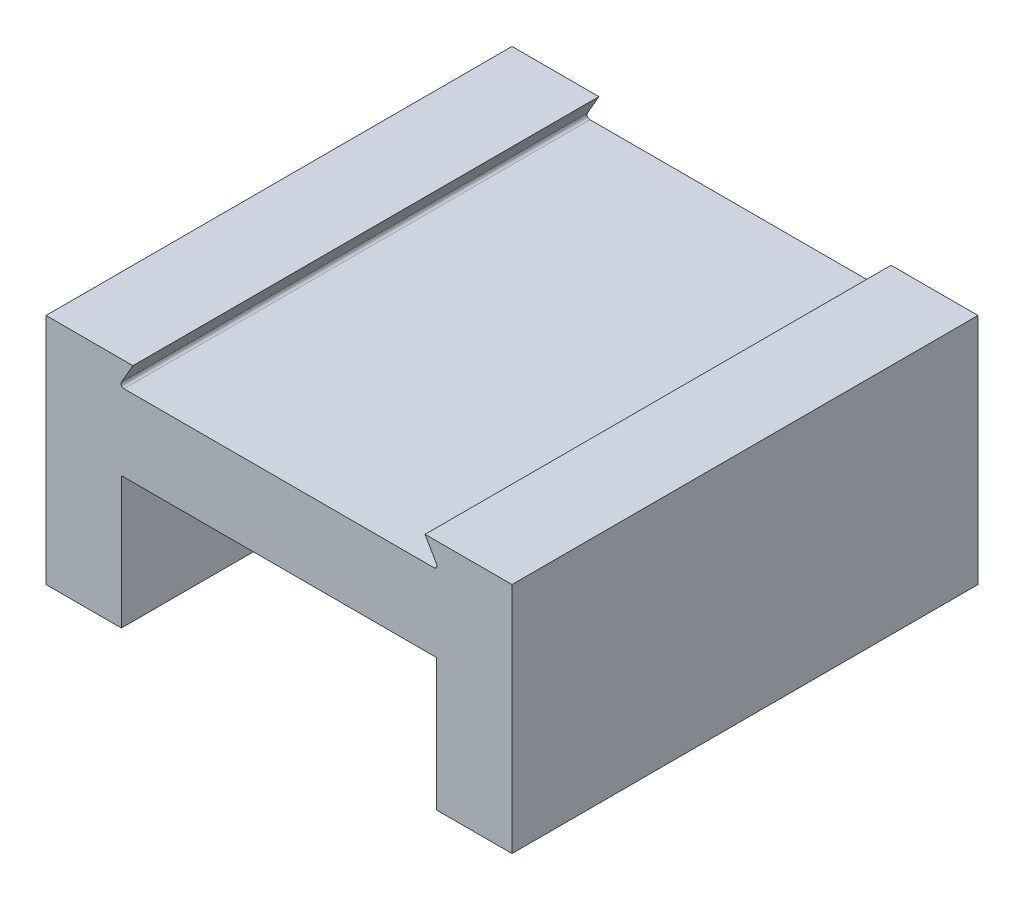
ISO-10303-21;
HEADER;
FILE_DESCRIPTION(('STEP AP214'),'2;1');
FILE_NAME('part.step','',(''),(''),'','','');
FILE_SCHEMA(('AUTOMOTIVE_DESIGN { 1 0 10303 214 1 1 1 1 }'));
ENDSEC;
DATA;
#1=APPLICATION_CONTEXT('core data for automotive mechanical design processes');
#2=APPLICATION_PROTOCOL_DEFINITION('international standard','automotive_design',2000,#1);
#3=PRODUCT_CONTEXT('',#1,'mechanical');
#4=PRODUCT('Part','Part','',(#3));
#5=PRODUCT_RELATED_PRODUCT_CATEGORY('part','',(#4));
#6=PRODUCT_DEFINITION_FORMATION('','',#4);
#7=PRODUCT_DEFINITION_CONTEXT('part definition',#1,'design');
#8=PRODUCT_DEFINITION('design','',#6,#7);
#9=PRODUCT_DEFINITION_SHAPE('','',#8);
#10=(LENGTH_UNIT() NAMED_UNIT(*) SI_UNIT(.MILLI.,.METRE.));
#11=(NAMED_UNIT(*) PLANE_ANGLE_UNIT() SI_UNIT($,.RADIAN.));
#12=(NAMED_UNIT(*) SI_UNIT($,.STERADIAN.) SOLID_ANGLE_UNIT());
#13=UNCERTAINTY_MEASURE_WITH_UNIT(LENGTH_MEASURE(1.E-05),#10,'distance_accuracy_value','');
#14=(GEOMETRIC_REPRESENTATION_CONTEXT(3) GLOBAL_UNCERTAINTY_ASSIGNED_CONTEXT((#13)) GLOBAL_UNIT_ASSIGNED_CONTEXT((#10,
#11,#12)) REPRESENTATION_CONTEXT('',''));
#15=CARTESIAN_POINT('',(0.,0.,0.));
#16=DIRECTION('',(0.,0.,1.));
#17=DIRECTION('',(1.,0.,0.));
#18=AXIS2_PLACEMENT_3D('',#15,#16,#17);
#19=CARTESIAN_POINT('',(-23.3046850178701,17.7004444554026,60.));
#20=DIRECTION('',(0.,-1.,0.));
#21=DIRECTION('',(1.,0.,0.));
#22=AXIS2_PLACEMENT_3D('',#19,#20,#21);
#23=PLANE('',#22);
#24=DIRECTION('',(-1.,0.,0.));
#25=VECTOR('',#24,1.);
#26=CARTESIAN_POINT('',(-23.3046850178701,17.7004444554026,0.));
#27=LINE('',#26,#25);
#28=CARTESIAN_POINT('',(-12.1110316699223,17.7004444554023,0.));
#29=VERTEX_POINT('',#28);
#30=CARTESIAN_POINT('',(-23.3046850178701,17.7004444554026,0.));
#31=VERTEX_POINT('',#30);
#32=EDGE_CURVE('E167',#29,#31,#27,.T.);
#33=ORIENTED_EDGE('',*,*,#32,.T.);
#34=DIRECTION('',(0.,0.,-1.));
#35=VECTOR('',#34,1.);
#36=CARTESIAN_POINT('',(-23.3046850178701,17.7004444554026,60.));
#37=LINE('',#36,#35);
#38=CARTESIAN_POINT('',(-23.3046850178701,17.7004444554026,60.));
#39=VERTEX_POINT('',#38);
#40=EDGE_CURVE('E11',#39,#31,#37,.T.);
#41=ORIENTED_EDGE('',*,*,#40,.F.);
#42=DIRECTION('',(-1.,0.,0.));
#43=VECTOR('',#42,1.);
#44=CARTESIAN_POINT('',(-23.3046850178701,17.7004444554026,60.));
#45=LINE('',#44,#43);
#46=CARTESIAN_POINT('',(-12.1110316699223,17.7004444554023,60.));
#47=VERTEX_POINT('',#46);
#48=EDGE_CURVE('E194',#47,#39,#45,.T.);
#49=ORIENTED_EDGE('',*,*,#48,.F.);
#50=DIRECTION('',(0.,0.,-1.));
#51=VECTOR('',#50,1.);
#52=CARTESIAN_POINT('',(-12.1110316699223,17.7004444554023,60.));
#53=LINE('',#52,#51);
#54=EDGE_CURVE('E163',#47,#29,#53,.T.);
#55=ORIENTED_EDGE('',*,*,#54,.T.);
#56=EDGE_LOOP('',(#33,#41,#49,#55));
#57=FACE_BOUND('',#56,.T.);
#58=ADVANCED_FACE('F35',(#57),#23,.F.);
#59=CARTESIAN_POINT('',(-23.3046850178701,17.7004444554026,60.));
#60=DIRECTION('',(1.,0.,0.));
#61=DIRECTION('',(0.,1.,0.));
#62=AXIS2_PLACEMENT_3D('',#59,#60,#61);
#63=PLANE('',#62);
#64=CARTESIAN_POINT('',(-23.3046850178701,-2.2995555445976,15.));
#65=DIRECTION('',(-1.,0.,0.));
#66=DIRECTION('',(0.,-1.,0.));
#67=AXIS2_PLACEMENT_3D('',#64,#65,#66);
#68=CIRCLE('',#67,4.25000000000001);
#69=CARTESIAN_POINT('',(-23.3046850178701,-6.5495555445976,15.));
#70=VERTEX_POINT('',#69);
#71=EDGE_CURVE('E373',#70,#70,#68,.T.);
#72=ORIENTED_EDGE('',*,*,#71,.F.);
#73=EDGE_LOOP('',(#72));
#74=FACE_BOUND('',#73,.T.);
#75=CARTESIAN_POINT('',(-23.3046850178701,-2.2995555445976,45.));
#76=DIRECTION('',(-1.,0.,0.));
#77=DIRECTION('',(0.,1.,0.));
#78=AXIS2_PLACEMENT_3D('',#75,#76,#77);
#79=CIRCLE('',#78,4.25);
#80=CARTESIAN_POINT('',(-23.3046850178701,1.9504444554024,45.));
#81=VERTEX_POINT('',#80);
#82=EDGE_CURVE('E378',#81,#81,#79,.T.);
#83=ORIENTED_EDGE('',*,*,#82,.F.);
#84=EDGE_LOOP('',(#83));
#85=FACE_BOUND('',#84,.T.);
#86=DIRECTION('',(0.,-1.,0.));
#87=VECTOR('',#86,1.);
#88=CARTESIAN_POINT('',(-23.3046850178701,17.7004444554026,0.));
#89=LINE('',#88,#87);
#90=CARTESIAN_POINT('',(-23.3046850178701,-12.2995555445976,0.));
#91=VERTEX_POINT('',#90);
#92=EDGE_CURVE('E170',#31,#91,#89,.T.);
#93=ORIENTED_EDGE('',*,*,#92,.T.);
#94=DIRECTION('',(0.,0.,-1.));
#95=VECTOR('',#94,1.);
#96=CARTESIAN_POINT('',(-23.3046850178701,-12.2995555445976,60.));
#97=LINE('',#96,#95);
#98=CARTESIAN_POINT('',(-23.3046850178701,-12.2995555445976,60.));
#99=VERTEX_POINT('',#98);
#100=EDGE_CURVE('E43',#99,#91,#97,.T.);
#101=ORIENTED_EDGE('',*,*,#100,.F.);
#102=DIRECTION('',(0.,-1.,0.));
#103=VECTOR('',#102,1.);
#104=CARTESIAN_POINT('',(-23.3046850178701,17.7004444554026,60.));
#105=LINE('',#104,#103);
#106=EDGE_CURVE('E112',#39,#99,#105,.T.);
#107=ORIENTED_EDGE('',*,*,#106,.F.);
#108=ORIENTED_EDGE('',*,*,#40,.T.);
#109=EDGE_LOOP('',(#93,#101,#107,#108));
#110=FACE_BOUND('',#109,.T.);
#111=ADVANCED_FACE('F282',(#74,#85,#110),#63,.F.);
#112=CARTESIAN_POINT('',(-23.3046850178701,-12.2995555445976,60.));
#113=DIRECTION('',(0.,1.,0.));
#114=DIRECTION('',(0.,0.,1.));
#115=AXIS2_PLACEMENT_3D('',#112,#113,#114);
#116=PLANE('',#115);
#117=DIRECTION('',(1.,0.,0.));
#118=VECTOR('',#117,1.);
#119=CARTESIAN_POINT('',(-23.3046850178701,-12.2995555445976,0.));
#120=LINE('',#119,#118);
#121=CARTESIAN_POINT('',(-13.5997293390279,-12.2995555445976,0.));
#122=VERTEX_POINT('',#121);
#123=EDGE_CURVE('E173',#91,#122,#120,.T.);
#124=ORIENTED_EDGE('',*,*,#123,.T.);
#125=DIRECTION('',(0.,0.,-1.));
#126=VECTOR('',#125,1.);
#127=CARTESIAN_POINT('',(-13.5997293390279,-12.2995555445976,60.));
#128=LINE('',#127,#126);
#129=CARTESIAN_POINT('',(-13.5997293390279,-12.2995555445976,60.));
#130=VERTEX_POINT('',#129);
#131=EDGE_CURVE('E219',#130,#122,#128,.T.);
#132=ORIENTED_EDGE('',*,*,#131,.F.);
#133=DIRECTION('',(1.,0.,0.));
#134=VECTOR('',#133,1.);
#135=CARTESIAN_POINT('',(-23.3046850178701,-12.2995555445976,60.));
#136=LINE('',#135,#134);
#137=EDGE_CURVE('E227',#99,#130,#136,.T.);
#138=ORIENTED_EDGE('',*,*,#137,.F.);
#139=ORIENTED_EDGE('',*,*,#100,.T.);
#140=EDGE_LOOP('',(#124,#132,#138,#139));
#141=FACE_BOUND('',#140,.T.);
#142=ADVANCED_FACE('F225',(#141),#116,.F.);
#143=CARTESIAN_POINT('',(-13.5997293390279,-12.2995555445976,60.));
#144=DIRECTION('',(-1.,0.,0.));
#145=DIRECTION('',(0.,-1.,0.));
#146=AXIS2_PLACEMENT_3D('',#143,#144,#145);
#147=PLANE('',#146);
#148=CARTESIAN_POINT('',(-13.5997293390279,-2.2995555445976,15.));
#149=DIRECTION('',(-1.,0.,0.));
#150=DIRECTION('',(0.,-1.,0.));
#151=AXIS2_PLACEMENT_3D('',#148,#149,#150);
#152=CIRCLE('',#151,4.25000000000001);
#153=CARTESIAN_POINT('',(-13.5997293390279,-6.5495555445976,15.));
#154=VERTEX_POINT('',#153);
#155=EDGE_CURVE('E171',#154,#154,#152,.F.);
#156=ORIENTED_EDGE('',*,*,#155,.F.);
#157=EDGE_LOOP('',(#156));
#158=FACE_BOUND('',#157,.T.);
#159=CARTESIAN_POINT('',(-13.5997293390279,-2.2995555445976,45.));
#160=DIRECTION('',(-1.,0.,0.));
#161=DIRECTION('',(0.,-1.,0.));
#162=AXIS2_PLACEMENT_3D('',#159,#160,#161);
#163=CIRCLE('',#162,4.25);
#164=CARTESIAN_POINT('',(-13.5997293390279,-6.54955554459759,45.));
#165=VERTEX_POINT('',#164);
#166=EDGE_CURVE('E374',#165,#165,#163,.F.);
#167=ORIENTED_EDGE('',*,*,#166,.F.);
#168=EDGE_LOOP('',(#167));
#169=FACE_BOUND('',#168,.T.);
#170=DIRECTION('',(0.,1.,0.));
#171=VECTOR('',#170,1.);
#172=CARTESIAN_POINT('',(-13.5997293390279,-12.2995555445976,0.));
#173=LINE('',#172,#171);
#174=CARTESIAN_POINT('',(-13.5997293390278,4.70044445540232,0.));
#175=VERTEX_POINT('',#174);
#176=EDGE_CURVE('E175',#122,#175,#173,.T.);
#177=ORIENTED_EDGE('',*,*,#176,.T.);
#178=DIRECTION('',(0.,0.,-1.));
#179=VECTOR('',#178,1.);
#180=CARTESIAN_POINT('',(-13.5997293390278,4.70044445540232,60.));
#181=LINE('',#180,#179);
#182=CARTESIAN_POINT('',(-13.5997293390278,4.70044445540232,60.));
#183=VERTEX_POINT('',#182);
#184=EDGE_CURVE('E216',#183,#175,#181,.T.);
#185=ORIENTED_EDGE('',*,*,#184,.F.);
#186=DIRECTION('',(0.,1.,0.));
#187=VECTOR('',#186,1.);
#188=CARTESIAN_POINT('',(-13.5997293390279,-12.2995555445976,60.));
#189=LINE('',#188,#187);
#190=EDGE_CURVE('E245',#130,#183,#189,.T.);
#191=ORIENTED_EDGE('',*,*,#190,.F.);
#192=ORIENTED_EDGE('',*,*,#131,.T.);
#193=EDGE_LOOP('',(#177,#185,#191,#192));
#194=FACE_BOUND('',#193,.T.);
#195=ADVANCED_FACE('F236',(#158,#169,#194),#147,.F.);
#196=CARTESIAN_POINT('',(-13.5997293390278,4.70044445540232,60.));
#197=DIRECTION('',(0.,1.,0.));
#198=DIRECTION('',(0.,0.,1.));
#199=AXIS2_PLACEMENT_3D('',#196,#197,#198);
#200=PLANE('',#199);
#201=DIRECTION('',(1.,0.,0.));
#202=VECTOR('',#201,1.);
#203=CARTESIAN_POINT('',(-13.5997293390278,4.70044445540232,0.));
#204=LINE('',#203,#202);
#205=CARTESIAN_POINT('',(26.9903593032884,4.70044445540232,0.));
#206=VERTEX_POINT('',#205);
#207=EDGE_CURVE('E177',#175,#206,#204,.T.);
#208=ORIENTED_EDGE('',*,*,#207,.T.);
#209=DIRECTION('',(0.,0.,-1.));
#210=VECTOR('',#209,1.);
#211=CARTESIAN_POINT('',(26.9903593032884,4.70044445540232,60.));
#212=LINE('',#211,#210);
#213=CARTESIAN_POINT('',(26.9903593032884,4.70044445540232,60.));
#214=VERTEX_POINT('',#213);
#215=EDGE_CURVE('E213',#214,#206,#212,.T.);
#216=ORIENTED_EDGE('',*,*,#215,.F.);
#217=DIRECTION('',(1.,0.,0.));
#218=VECTOR('',#217,1.);
#219=CARTESIAN_POINT('',(-13.5997293390278,4.70044445540232,60.));
#220=LINE('',#219,#218);
#221=EDGE_CURVE('E242',#183,#214,#220,.T.);
#222=ORIENTED_EDGE('',*,*,#221,.F.);
#223=ORIENTED_EDGE('',*,*,#184,.T.);
#224=EDGE_LOOP('',(#208,#216,#222,#223));
#225=FACE_BOUND('',#224,.T.);
#226=ADVANCED_FACE('F240',(#225),#200,.F.);
#227=CARTESIAN_POINT('',(26.9903593032883,-12.2995555445976,60.));
#228=DIRECTION('',(1.,0.,0.));
#229=DIRECTION('',(0.,1.,0.));
#230=AXIS2_PLACEMENT_3D('',#227,#228,#229);
#231=PLANE('',#230);
#232=DIRECTION('',(0.,-1.,0.));
#233=VECTOR('',#232,1.);
#234=CARTESIAN_POINT('',(26.9903593032883,-12.2995555445976,0.));
#235=LINE('',#234,#233);
#236=CARTESIAN_POINT('',(26.9903593032883,-12.2995555445976,0.));
#237=VERTEX_POINT('',#236);
#238=EDGE_CURVE('E179',#206,#237,#235,.T.);
#239=ORIENTED_EDGE('',*,*,#238,.T.);
#240=DIRECTION('',(0.,0.,-1.));
#241=VECTOR('',#240,1.);
#242=CARTESIAN_POINT('',(26.9903593032883,-12.2995555445976,60.));
#243=LINE('',#242,#241);
#244=CARTESIAN_POINT('',(26.9903593032883,-12.2995555445976,60.));
#245=VERTEX_POINT('',#244);
#246=EDGE_CURVE('E210',#245,#237,#243,.T.);
#247=ORIENTED_EDGE('',*,*,#246,.F.);
#248=DIRECTION('',(0.,-1.,0.));
#249=VECTOR('',#248,1.);
#250=CARTESIAN_POINT('',(26.9903593032883,-12.2995555445976,60.));
#251=LINE('',#250,#249);
#252=EDGE_CURVE('E244',#214,#245,#251,.T.);
#253=ORIENTED_EDGE('',*,*,#252,.F.);
#254=ORIENTED_EDGE('',*,*,#215,.T.);
#255=EDGE_LOOP('',(#239,#247,#253,#254));
#256=FACE_BOUND('',#255,.T.);
#257=ADVANCED_FACE('F300',(#256),#231,.F.);
#258=CARTESIAN_POINT('',(26.9903593032883,-12.2995555445976,60.));
#259=DIRECTION('',(0.,1.,0.));
#260=DIRECTION('',(0.,0.,1.));
#261=AXIS2_PLACEMENT_3D('',#258,#259,#260);
#262=PLANE('',#261);
#263=DIRECTION('',(1.,0.,0.));
#264=VECTOR('',#263,1.);
#265=CARTESIAN_POINT('',(26.9903593032883,-12.2995555445976,0.));
#266=LINE('',#265,#264);
#267=CARTESIAN_POINT('',(36.6953149821299,-12.2995555445976,0.));
#268=VERTEX_POINT('',#267);
#269=EDGE_CURVE('E181',#237,#268,#266,.T.);
#270=ORIENTED_EDGE('',*,*,#269,.T.);
#271=DIRECTION('',(0.,0.,-1.));
#272=VECTOR('',#271,1.);
#273=CARTESIAN_POINT('',(36.6953149821299,-12.2995555445976,60.));
#274=LINE('',#273,#272);
#275=CARTESIAN_POINT('',(36.6953149821299,-12.2995555445976,60.));
#276=VERTEX_POINT('',#275);
#277=EDGE_CURVE('E207',#276,#268,#274,.T.);
#278=ORIENTED_EDGE('',*,*,#277,.F.);
#279=DIRECTION('',(1.,0.,0.));
#280=VECTOR('',#279,1.);
#281=CARTESIAN_POINT('',(26.9903593032883,-12.2995555445976,60.));
#282=LINE('',#281,#280);
#283=EDGE_CURVE('E247',#245,#276,#282,.T.);
#284=ORIENTED_EDGE('',*,*,#283,.F.);
#285=ORIENTED_EDGE('',*,*,#246,.T.);
#286=EDGE_LOOP('',(#270,#278,#284,#285));
#287=FACE_BOUND('',#286,.T.);
#288=ADVANCED_FACE('F303',(#287),#262,.F.);
#289=CARTESIAN_POINT('',(36.6953149821299,17.7004444554026,60.));
#290=DIRECTION('',(-1.,0.,0.));
#291=DIRECTION('',(0.,-1.,0.));
#292=AXIS2_PLACEMENT_3D('',#289,#290,#291);
#293=PLANE('',#292);
#294=DIRECTION('',(0.,1.,0.));
#295=VECTOR('',#294,1.);
#296=CARTESIAN_POINT('',(36.6953149821299,17.7004444554026,0.));
#297=LINE('',#296,#295);
#298=CARTESIAN_POINT('',(36.6953149821299,17.7004444554026,0.));
#299=VERTEX_POINT('',#298);
#300=EDGE_CURVE('E183',#268,#299,#297,.T.);
#301=ORIENTED_EDGE('',*,*,#300,.T.);
#302=DIRECTION('',(0.,0.,-1.));
#303=VECTOR('',#302,1.);
#304=CARTESIAN_POINT('',(36.6953149821299,17.7004444554026,60.));
#305=LINE('',#304,#303);
#306=CARTESIAN_POINT('',(36.6953149821299,17.7004444554026,60.));
#307=VERTEX_POINT('',#306);
#308=EDGE_CURVE('E204',#307,#299,#305,.T.);
#309=ORIENTED_EDGE('',*,*,#308,.F.);
#310=DIRECTION('',(0.,1.,0.));
#311=VECTOR('',#310,1.);
#312=CARTESIAN_POINT('',(36.6953149821299,17.7004444554026,60.));
#313=LINE('',#312,#311);
#314=EDGE_CURVE('E253',#276,#307,#313,.T.);
#315=ORIENTED_EDGE('',*,*,#314,.F.);
#316=ORIENTED_EDGE('',*,*,#277,.T.);
#317=EDGE_LOOP('',(#301,#309,#315,#316));
#318=FACE_BOUND('',#317,.T.);
#319=ADVANCED_FACE('F307',(#318),#293,.F.);
#320=CARTESIAN_POINT('',(25.5016616341825,17.7004444554026,60.));
#321=DIRECTION('',(0.,-1.,0.));
#322=DIRECTION('',(1.,0.,0.));
#323=AXIS2_PLACEMENT_3D('',#320,#321,#322);
#324=PLANE('',#323);
#325=DIRECTION('',(-1.,0.,0.));
#326=VECTOR('',#325,1.);
#327=CARTESIAN_POINT('',(25.5016616341825,17.7004444554026,0.));
#328=LINE('',#327,#326);
#329=CARTESIAN_POINT('',(25.5016616341825,17.7004444554026,0.));
#330=VERTEX_POINT('',#329);
#331=EDGE_CURVE('E185',#299,#330,#328,.T.);
#332=ORIENTED_EDGE('',*,*,#331,.T.);
#333=DIRECTION('',(0.,0.,-1.));
#334=VECTOR('',#333,1.);
#335=CARTESIAN_POINT('',(25.5016616341825,17.7004444554026,60.));
#336=LINE('',#335,#334);
#337=CARTESIAN_POINT('',(25.5016616341825,17.7004444554026,60.));
#338=VERTEX_POINT('',#337);
#339=EDGE_CURVE('E201',#338,#330,#336,.T.);
#340=ORIENTED_EDGE('',*,*,#339,.F.);
#341=DIRECTION('',(-1.,0.,0.));
#342=VECTOR('',#341,1.);
#343=CARTESIAN_POINT('',(25.5016616341825,17.7004444554026,60.));
#344=LINE('',#343,#342);
#345=EDGE_CURVE('E255',#307,#338,#344,.T.);
#346=ORIENTED_EDGE('',*,*,#345,.F.);
#347=ORIENTED_EDGE('',*,*,#308,.T.);
#348=EDGE_LOOP('',(#332,#340,#346,#347));
#349=FACE_BOUND('',#348,.T.);
#350=ADVANCED_FACE('F311',(#349),#324,.F.);
#351=CARTESIAN_POINT('',(25.5016616341825,17.7004444554026,60.));
#352=DIRECTION('',(0.866025403784436,0.500000000000005,0.));
#353=DIRECTION('',(-0.500000000000005,0.866025403784436,0.));
#354=AXIS2_PLACEMENT_3D('',#351,#352,#353);
#355=PLANE('',#354);
#356=DIRECTION('',(0.500000000000005,-0.866025403784436,0.));
#357=VECTOR('',#356,1.);
#358=CARTESIAN_POINT('',(25.5016616341825,17.7004444554026,0.));
#359=LINE('',#358,#357);
#360=CARTESIAN_POINT('',(26.990359303288,15.1219444554026,0.));
#361=VERTEX_POINT('',#360);
#362=EDGE_CURVE('E187',#330,#361,#359,.T.);
#363=ORIENTED_EDGE('',*,*,#362,.T.);
#364=DIRECTION('',(0.,0.,-1.));
#365=VECTOR('',#364,1.);
#366=CARTESIAN_POINT('',(26.990359303288,15.1219444554026,60.));
#367=LINE('',#366,#365);
#368=CARTESIAN_POINT('',(26.990359303288,15.1219444554026,60.));
#369=VERTEX_POINT('',#368);
#370=EDGE_CURVE('E198',#369,#361,#367,.T.);
#371=ORIENTED_EDGE('',*,*,#370,.F.);
#372=DIRECTION('',(0.500000000000005,-0.866025403784436,0.));
#373=VECTOR('',#372,1.);
#374=CARTESIAN_POINT('',(25.5016616341825,17.7004444554026,60.));
#375=LINE('',#374,#373);
#376=EDGE_CURVE('E257',#338,#369,#375,.T.);
#377=ORIENTED_EDGE('',*,*,#376,.F.);
#378=ORIENTED_EDGE('',*,*,#339,.T.);
#379=EDGE_LOOP('',(#363,#371,#377,#378));
#380=FACE_BOUND('',#379,.T.);
#381=ADVANCED_FACE('F263',(#380),#355,.F.);
#382=CARTESIAN_POINT('',(26.6604036244461,14.9314444554026,60.));
#383=DIRECTION('',(0.,0.,-1.));
#384=DIRECTION('',(-1.,0.,0.));
#385=AXIS2_PLACEMENT_3D('',#382,#383,#384);
#386=CYLINDRICAL_SURFACE('',#385,0.381);
#387=CARTESIAN_POINT('',(26.6604036244461,14.9314444554026,0.));
#388=DIRECTION('',(0.,0.,-1.));
#389=DIRECTION('',(-1.,0.,0.));
#390=AXIS2_PLACEMENT_3D('',#387,#388,#389);
#391=CIRCLE('',#390,0.381);
#392=CARTESIAN_POINT('',(26.6604036244461,14.5504444554026,0.));
#393=VERTEX_POINT('',#392);
#394=EDGE_CURVE('E189',#361,#393,#391,.T.);
#395=ORIENTED_EDGE('',*,*,#394,.T.);
#396=DIRECTION('',(0.,0.,-1.));
#397=VECTOR('',#396,1.);
#398=CARTESIAN_POINT('',(26.6604036244461,14.5504444554026,60.));
#399=LINE('',#398,#397);
#400=CARTESIAN_POINT('',(26.6604036244461,14.5504444554026,60.));
#401=VERTEX_POINT('',#400);
#402=EDGE_CURVE('E158',#401,#393,#399,.T.);
#403=ORIENTED_EDGE('',*,*,#402,.F.);
#404=CARTESIAN_POINT('',(26.6604036244461,14.9314444554026,60.));
#405=DIRECTION('',(0.,0.,-1.));
#406=DIRECTION('',(-1.,0.,0.));
#407=AXIS2_PLACEMENT_3D('',#404,#405,#406);
#408=CIRCLE('',#407,0.381);
#409=EDGE_CURVE('E149',#369,#401,#408,.T.);
#410=ORIENTED_EDGE('',*,*,#409,.F.);
#411=ORIENTED_EDGE('',*,*,#370,.T.);
#412=EDGE_LOOP('',(#395,#403,#410,#411));
#413=FACE_BOUND('',#412,.T.);
#414=ADVANCED_FACE('F267',(#413),#386,.F.);
#415=CARTESIAN_POINT('',(-13.2697736601859,14.5504444554023,60.));
#416=DIRECTION('',(0.,-1.,0.));
#417=DIRECTION('',(1.,0.,0.));
#418=AXIS2_PLACEMENT_3D('',#415,#416,#417);
#419=PLANE('',#418);
#420=DIRECTION('',(-1.,0.,0.));
#421=VECTOR('',#420,1.);
#422=CARTESIAN_POINT('',(-13.2697736601859,14.5504444554023,0.));
#423=LINE('',#422,#421);
#424=CARTESIAN_POINT('',(-13.2697736601859,14.5504444554023,0.));
#425=VERTEX_POINT('',#424);
#426=EDGE_CURVE('E157',#393,#425,#423,.T.);
#427=ORIENTED_EDGE('',*,*,#426,.T.);
#428=DIRECTION('',(0.,0.,-1.));
#429=VECTOR('',#428,1.);
#430=CARTESIAN_POINT('',(-13.2697736601859,14.5504444554023,60.));
#431=LINE('',#430,#429);
#432=CARTESIAN_POINT('',(-13.2697736601859,14.5504444554023,60.));
#433=VERTEX_POINT('',#432);
#434=EDGE_CURVE('E154',#433,#425,#431,.T.);
#435=ORIENTED_EDGE('',*,*,#434,.F.);
#436=DIRECTION('',(-1.,0.,0.));
#437=VECTOR('',#436,1.);
#438=CARTESIAN_POINT('',(-13.2697736601859,14.5504444554023,60.));
#439=LINE('',#438,#437);
#440=EDGE_CURVE('E143',#401,#433,#439,.T.);
#441=ORIENTED_EDGE('',*,*,#440,.F.);
#442=ORIENTED_EDGE('',*,*,#402,.T.);
#443=EDGE_LOOP('',(#427,#435,#441,#442));
#444=FACE_BOUND('',#443,.T.);
#445=ADVANCED_FACE('F155',(#444),#419,.F.);
#446=CARTESIAN_POINT('',(-13.2697736601864,14.9314444554026,60.));
#447=DIRECTION('',(0.,0.,-1.));
#448=DIRECTION('',(-1.,0.,0.));
#449=AXIS2_PLACEMENT_3D('',#446,#447,#448);
#450=CYLINDRICAL_SURFACE('',#449,0.380999999999873);
#451=CARTESIAN_POINT('',(-13.2697736601864,14.9314444554026,0.));
#452=DIRECTION('',(0.,0.,-1.));
#453=DIRECTION('',(1.,0.,0.));
#454=AXIS2_PLACEMENT_3D('',#451,#452,#453);
#455=CIRCLE('',#454,0.380999999999873);
#456=CARTESIAN_POINT('',(-13.5997293390281,15.1219444554025,0.));
#457=VERTEX_POINT('',#456);
#458=EDGE_CURVE('E98',#425,#457,#455,.T.);
#459=ORIENTED_EDGE('',*,*,#458,.T.);
#460=DIRECTION('',(0.,0.,-1.));
#461=VECTOR('',#460,1.);
#462=CARTESIAN_POINT('',(-13.5997293390281,15.1219444554025,60.));
#463=LINE('',#462,#461);
#464=CARTESIAN_POINT('',(-13.5997293390281,15.1219444554025,60.));
#465=VERTEX_POINT('',#464);
#466=EDGE_CURVE('E159',#465,#457,#463,.T.);
#467=ORIENTED_EDGE('',*,*,#466,.F.);
#468=CARTESIAN_POINT('',(-13.2697736601864,14.9314444554026,60.));
#469=DIRECTION('',(0.,0.,-1.));
#470=DIRECTION('',(1.,0.,0.));
#471=AXIS2_PLACEMENT_3D('',#468,#469,#470);
#472=CIRCLE('',#471,0.380999999999873);
#473=EDGE_CURVE('E147',#433,#465,#472,.T.);
#474=ORIENTED_EDGE('',*,*,#473,.F.);
#475=ORIENTED_EDGE('',*,*,#434,.T.);
#476=EDGE_LOOP('',(#459,#467,#474,#475));
#477=FACE_BOUND('',#476,.T.);
#478=ADVANCED_FACE('F161',(#477),#450,.F.);
#479=CARTESIAN_POINT('',(-12.1110316699223,17.7004444554023,60.));
#480=DIRECTION('',(-0.866025403784436,0.500000000000004,0.));
#481=DIRECTION('',(-0.500000000000004,-0.866025403784436,0.));
#482=AXIS2_PLACEMENT_3D('',#479,#480,#481);
#483=PLANE('',#482);
#484=DIRECTION('',(0.500000000000004,0.866025403784436,0.));
#485=VECTOR('',#484,1.);
#486=CARTESIAN_POINT('',(-12.1110316699223,17.7004444554023,0.));
#487=LINE('',#486,#485);
#488=EDGE_CURVE('E104',#457,#29,#487,.T.);
#489=ORIENTED_EDGE('',*,*,#488,.T.);
#490=ORIENTED_EDGE('',*,*,#54,.F.);
#491=DIRECTION('',(0.500000000000004,0.866025403784436,0.));
#492=VECTOR('',#491,1.);
#493=CARTESIAN_POINT('',(-12.1110316699223,17.7004444554023,60.));
#494=LINE('',#493,#492);
#495=EDGE_CURVE('E51',#465,#47,#494,.T.);
#496=ORIENTED_EDGE('',*,*,#495,.F.);
#497=ORIENTED_EDGE('',*,*,#466,.T.);
#498=EDGE_LOOP('',(#489,#490,#496,#497));
#499=FACE_BOUND('',#498,.T.);
#500=ADVANCED_FACE('F271',(#499),#483,.F.);
#501=CARTESIAN_POINT('',(-13.2697736601864,14.9314444554026,60.));
#502=DIRECTION('',(0.,0.,1.));
#503=DIRECTION('',(1.,0.,0.));
#504=AXIS2_PLACEMENT_3D('',#501,#502,#503);
#505=PLANE('',#504);
#506=ORIENTED_EDGE('',*,*,#48,.T.);
#507=ORIENTED_EDGE('',*,*,#106,.T.);
#508=ORIENTED_EDGE('',*,*,#137,.T.);
#509=ORIENTED_EDGE('',*,*,#190,.T.);
#510=ORIENTED_EDGE('',*,*,#221,.T.);
#511=ORIENTED_EDGE('',*,*,#252,.T.);
#512=ORIENTED_EDGE('',*,*,#283,.T.);
#513=ORIENTED_EDGE('',*,*,#314,.T.);
#514=ORIENTED_EDGE('',*,*,#345,.T.);
#515=ORIENTED_EDGE('',*,*,#376,.T.);
#516=ORIENTED_EDGE('',*,*,#409,.T.);
#517=ORIENTED_EDGE('',*,*,#440,.T.);
#518=ORIENTED_EDGE('',*,*,#473,.T.);
#519=ORIENTED_EDGE('',*,*,#495,.T.);
#520=EDGE_LOOP('',(#506,#507,#508,#509,#510,#511,#512,#513,#514,#515,#516,#517,#518,#519));
#521=FACE_BOUND('',#520,.T.);
#522=ADVANCED_FACE('F145',(#521),#505,.T.);
#523=CARTESIAN_POINT('',(-13.2697736601864,14.9314444554026,0.));
#524=DIRECTION('',(0.,0.,1.));
#525=DIRECTION('',(1.,0.,0.));
#526=AXIS2_PLACEMENT_3D('',#523,#524,#525);
#527=PLANE('',#526);
#528=ORIENTED_EDGE('',*,*,#32,.F.);
#529=ORIENTED_EDGE('',*,*,#488,.F.);
#530=ORIENTED_EDGE('',*,*,#458,.F.);
#531=ORIENTED_EDGE('',*,*,#426,.F.);
#532=ORIENTED_EDGE('',*,*,#394,.F.);
#533=ORIENTED_EDGE('',*,*,#362,.F.);
#534=ORIENTED_EDGE('',*,*,#331,.F.);
#535=ORIENTED_EDGE('',*,*,#300,.F.);
#536=ORIENTED_EDGE('',*,*,#269,.F.);
#537=ORIENTED_EDGE('',*,*,#238,.F.);
#538=ORIENTED_EDGE('',*,*,#207,.F.);
#539=ORIENTED_EDGE('',*,*,#176,.F.);
#540=ORIENTED_EDGE('',*,*,#123,.F.);
#541=ORIENTED_EDGE('',*,*,#92,.F.);
#542=EDGE_LOOP('',(#528,#529,#530,#531,#532,#533,#534,#535,#536,#537,#538,#539,#540,#541));
#543=FACE_BOUND('',#542,.T.);
#544=ADVANCED_FACE('F231',(#543),#527,.F.);
#545=CARTESIAN_POINT('',(-1.57891405885655,-2.29955554459759,45.));
#546=DIRECTION('',(-1.,0.,0.));
#547=DIRECTION('',(0.,-1.,0.));
#548=AXIS2_PLACEMENT_3D('',#545,#546,#547);
#549=CYLINDRICAL_SURFACE('',#548,4.25);
#550=ORIENTED_EDGE('',*,*,#166,.T.);
#551=EDGE_LOOP('',(#550));
#552=FACE_BOUND('',#551,.T.);
#553=ORIENTED_EDGE('',*,*,#82,.T.);
#554=EDGE_LOOP('',(#553));
#555=FACE_BOUND('',#554,.T.);
#556=ADVANCED_FACE('F346',(#552,#555),#549,.F.);
#557=CARTESIAN_POINT('',(-1.57891405885655,-2.29955554459759,15.));
#558=DIRECTION('',(-1.,0.,0.));
#559=DIRECTION('',(0.,-1.,0.));
#560=AXIS2_PLACEMENT_3D('',#557,#558,#559);
#561=CYLINDRICAL_SURFACE('',#560,4.25000000000001);
#562=ORIENTED_EDGE('',*,*,#155,.T.);
#563=EDGE_LOOP('',(#562));
#564=FACE_BOUND('',#563,.T.);
#565=ORIENTED_EDGE('',*,*,#71,.T.);
#566=EDGE_LOOP('',(#565));
#567=FACE_BOUND('',#566,.T.);
#568=ADVANCED_FACE('F355',(#564,#567),#561,.F.);
#569=CLOSED_SHELL('',(#58,#111,#142,#195,#226,#257,#288,#319,#350,#381,#414,#445,#478,#500,#522,
#544,#556,#568));
#570=MANIFOLD_SOLID_BREP('B2',#569);
#571=ADVANCED_BREP_SHAPE_REPRESENTATION('',(#18,#570),#14);
#572=SHAPE_DEFINITION_REPRESENTATION(#9,#571);
ENDSEC;
END-ISO-10303-21;
